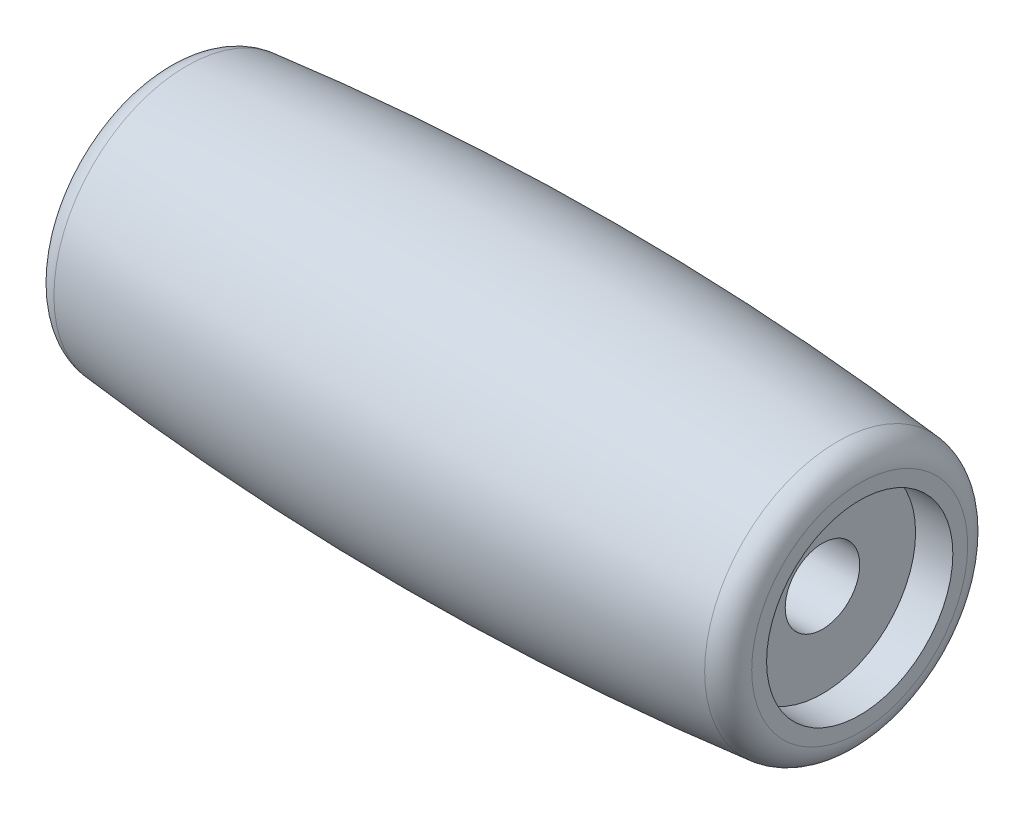
ISO-10303-21;
HEADER;
FILE_DESCRIPTION(('STEP AP214'),'2;1');
FILE_NAME('part.step','',(''),(''),'','','');
FILE_SCHEMA(('AUTOMOTIVE_DESIGN { 1 0 10303 214 1 1 1 1 }'));
ENDSEC;
DATA;
#1=APPLICATION_CONTEXT('core data for automotive mechanical design processes');
#2=APPLICATION_PROTOCOL_DEFINITION('international standard','automotive_design',2000,#1);
#3=PRODUCT_CONTEXT('',#1,'mechanical');
#4=PRODUCT('Part','Part','',(#3));
#5=PRODUCT_RELATED_PRODUCT_CATEGORY('part','',(#4));
#6=PRODUCT_DEFINITION_FORMATION('','',#4);
#7=PRODUCT_DEFINITION_CONTEXT('part definition',#1,'design');
#8=PRODUCT_DEFINITION('design','',#6,#7);
#9=PRODUCT_DEFINITION_SHAPE('','',#8);
#10=(LENGTH_UNIT() NAMED_UNIT(*) SI_UNIT(.MILLI.,.METRE.));
#11=(NAMED_UNIT(*) PLANE_ANGLE_UNIT() SI_UNIT($,.RADIAN.));
#12=(NAMED_UNIT(*) SI_UNIT($,.STERADIAN.) SOLID_ANGLE_UNIT());
#13=UNCERTAINTY_MEASURE_WITH_UNIT(LENGTH_MEASURE(1.E-05),#10,'distance_accuracy_value','');
#14=(GEOMETRIC_REPRESENTATION_CONTEXT(3) GLOBAL_UNCERTAINTY_ASSIGNED_CONTEXT((#13)) GLOBAL_UNIT_ASSIGNED_CONTEXT((#10,
#11,#12)) REPRESENTATION_CONTEXT('',''));
#15=CARTESIAN_POINT('',(0.,0.,0.));
#16=DIRECTION('',(0.,0.,1.));
#17=DIRECTION('',(1.,0.,0.));
#18=AXIS2_PLACEMENT_3D('',#15,#16,#17);
#19=CARTESIAN_POINT('',(12.5,1.5,0.));
#20=DIRECTION('',(-1.,0.,0.));
#21=DIRECTION('',(0.,0.,1.));
#22=AXIS2_PLACEMENT_3D('',#19,#20,#21);
#23=PLANE('',#22);
#24=CARTESIAN_POINT('',(12.5,0.,0.));
#25=DIRECTION('',(-1.,0.,0.));
#26=DIRECTION('',(0.,0.,1.));
#27=AXIS2_PLACEMENT_3D('',#24,#25,#26);
#28=CIRCLE('',#27,3.75);
#29=CARTESIAN_POINT('',(12.5,0.,3.75));
#30=VERTEX_POINT('',#29);
#31=EDGE_CURVE('E10',#30,#30,#28,.T.);
#32=ORIENTED_EDGE('',*,*,#31,.F.);
#33=EDGE_LOOP('',(#32));
#34=FACE_BOUND('',#33,.T.);
#35=CARTESIAN_POINT('',(12.5,0.,0.));
#36=DIRECTION('',(-1.,0.,0.));
#37=DIRECTION('',(0.,0.,1.));
#38=AXIS2_PLACEMENT_3D('',#35,#36,#37);
#39=CIRCLE('',#38,1.5);
#40=CARTESIAN_POINT('',(12.5,0.,1.5));
#41=VERTEX_POINT('',#40);
#42=EDGE_CURVE('E84',#41,#41,#39,.T.);
#43=ORIENTED_EDGE('',*,*,#42,.T.);
#44=EDGE_LOOP('',(#43));
#45=FACE_BOUND('',#44,.T.);
#46=ADVANCED_FACE('F41',(#34,#45),#23,.F.);
#47=CARTESIAN_POINT('',(0.,0.,0.));
#48=DIRECTION('',(-1.,0.,0.));
#49=DIRECTION('',(0.,0.,1.));
#50=AXIS2_PLACEMENT_3D('',#47,#48,#49);
#51=CYLINDRICAL_SURFACE('',#50,3.75);
#52=CARTESIAN_POINT('',(14.,0.,0.));
#53=DIRECTION('',(-1.,0.,0.));
#54=DIRECTION('',(0.,0.,1.));
#55=AXIS2_PLACEMENT_3D('',#52,#53,#54);
#56=CIRCLE('',#55,3.75);
#57=CARTESIAN_POINT('',(14.,0.,3.75));
#58=VERTEX_POINT('',#57);
#59=EDGE_CURVE('E48',#58,#58,#56,.T.);
#60=ORIENTED_EDGE('',*,*,#59,.F.);
#61=EDGE_LOOP('',(#60));
#62=FACE_BOUND('',#61,.T.);
#63=ORIENTED_EDGE('',*,*,#31,.T.);
#64=EDGE_LOOP('',(#63));
#65=FACE_BOUND('',#64,.T.);
#66=ADVANCED_FACE('F134',(#62,#65),#51,.F.);
#67=CARTESIAN_POINT('',(14.,3.75,0.));
#68=DIRECTION('',(-1.,0.,0.));
#69=DIRECTION('',(0.,0.,1.));
#70=AXIS2_PLACEMENT_3D('',#67,#68,#69);
#71=PLANE('',#70);
#72=CARTESIAN_POINT('',(14.,0.,0.));
#73=DIRECTION('',(-1.,0.,0.));
#74=DIRECTION('',(0.,0.,1.));
#75=AXIS2_PLACEMENT_3D('',#72,#73,#74);
#76=CIRCLE('',#75,4.34857666506388);
#77=CARTESIAN_POINT('',(14.,0.,4.34857666506388));
#78=VERTEX_POINT('',#77);
#79=EDGE_CURVE('E53',#78,#78,#76,.T.);
#80=ORIENTED_EDGE('',*,*,#79,.F.);
#81=EDGE_LOOP('',(#80));
#82=FACE_BOUND('',#81,.T.);
#83=ORIENTED_EDGE('',*,*,#59,.T.);
#84=EDGE_LOOP('',(#83));
#85=FACE_BOUND('',#84,.T.);
#86=ADVANCED_FACE('F129',(#82,#85),#71,.F.);
#87=CARTESIAN_POINT('',(13.,0.,0.));
#88=DIRECTION('',(-1.,0.,0.));
#89=DIRECTION('',(0.,0.,1.));
#90=AXIS2_PLACEMENT_3D('',#87,#88,#89);
#91=TOROIDAL_SURFACE('',#90,4.34857666506388,1.00000000000001);
#92=CARTESIAN_POINT('',(13.0999679589875,0.,0.));
#93=DIRECTION('',(-1.,0.,0.));
#94=DIRECTION('',(0.,0.,1.));
#95=AXIS2_PLACEMENT_3D('',#92,#93,#94);
#96=CIRCLE('',#95,5.34356732189234);
#97=CARTESIAN_POINT('',(13.0999679589875,0.,5.34356732189234));
#98=VERTEX_POINT('',#97);
#99=EDGE_CURVE('E58',#98,#98,#96,.T.);
#100=ORIENTED_EDGE('',*,*,#99,.F.);
#101=EDGE_LOOP('',(#100));
#102=FACE_BOUND('',#101,.T.);
#103=ORIENTED_EDGE('',*,*,#79,.T.);
#104=EDGE_LOOP('',(#103));
#105=FACE_BOUND('',#104,.T.);
#106=ADVANCED_FACE('F123',(#102,#105),#91,.T.);
#107=CARTESIAN_POINT('',(0.,0.,0.));
#108=DIRECTION('',(-1.,0.,0.));
#109=DIRECTION('',(0.,0.,1.));
#110=AXIS2_PLACEMENT_3D('',#107,#108,#109);
#111=DEGENERATE_TOROIDAL_SURFACE('',#110,125.041666666667,131.041666666667,.F.);
#112=CARTESIAN_POINT('',(-13.0999679589875,0.,0.));
#113=DIRECTION('',(-1.,0.,0.));
#114=DIRECTION('',(0.,0.,1.));
#115=AXIS2_PLACEMENT_3D('',#112,#113,#114);
#116=CIRCLE('',#115,5.34356732189233);
#117=CARTESIAN_POINT('',(-13.0999679589875,0.,5.34356732189233));
#118=VERTEX_POINT('',#117);
#119=EDGE_CURVE('E64',#118,#118,#116,.T.);
#120=ORIENTED_EDGE('',*,*,#119,.F.);
#121=EDGE_LOOP('',(#120));
#122=FACE_BOUND('',#121,.T.);
#123=ORIENTED_EDGE('',*,*,#99,.T.);
#124=EDGE_LOOP('',(#123));
#125=FACE_BOUND('',#124,.T.);
#126=ADVANCED_FACE('F117',(#122,#125),#111,.F.);
#127=CARTESIAN_POINT('',(-13.,0.,0.));
#128=DIRECTION('',(-1.,0.,0.));
#129=DIRECTION('',(0.,0.,1.));
#130=AXIS2_PLACEMENT_3D('',#127,#128,#129);
#131=TOROIDAL_SURFACE('',#130,4.34857666506388,1.00000000000001);
#132=CARTESIAN_POINT('',(-14.,0.,0.));
#133=DIRECTION('',(-1.,0.,0.));
#134=DIRECTION('',(0.,0.,1.));
#135=AXIS2_PLACEMENT_3D('',#132,#133,#134);
#136=CIRCLE('',#135,4.34857666506388);
#137=CARTESIAN_POINT('',(-14.,0.,4.34857666506388));
#138=VERTEX_POINT('',#137);
#139=EDGE_CURVE('E68',#138,#138,#136,.T.);
#140=ORIENTED_EDGE('',*,*,#139,.F.);
#141=EDGE_LOOP('',(#140));
#142=FACE_BOUND('',#141,.T.);
#143=ORIENTED_EDGE('',*,*,#119,.T.);
#144=EDGE_LOOP('',(#143));
#145=FACE_BOUND('',#144,.T.);
#146=ADVANCED_FACE('F111',(#142,#145),#131,.T.);
#147=CARTESIAN_POINT('',(-14.,3.75,0.));
#148=DIRECTION('',(1.,0.,0.));
#149=DIRECTION('',(0.,0.,-1.));
#150=AXIS2_PLACEMENT_3D('',#147,#148,#149);
#151=PLANE('',#150);
#152=CARTESIAN_POINT('',(-14.,0.,0.));
#153=DIRECTION('',(-1.,0.,0.));
#154=DIRECTION('',(0.,0.,1.));
#155=AXIS2_PLACEMENT_3D('',#152,#153,#154);
#156=CIRCLE('',#155,3.75);
#157=CARTESIAN_POINT('',(-14.,0.,3.75));
#158=VERTEX_POINT('',#157);
#159=EDGE_CURVE('E72',#158,#158,#156,.T.);
#160=ORIENTED_EDGE('',*,*,#159,.F.);
#161=EDGE_LOOP('',(#160));
#162=FACE_BOUND('',#161,.T.);
#163=ORIENTED_EDGE('',*,*,#139,.T.);
#164=EDGE_LOOP('',(#163));
#165=FACE_BOUND('',#164,.T.);
#166=ADVANCED_FACE('F105',(#162,#165),#151,.F.);
#167=CARTESIAN_POINT('',(0.,0.,0.));
#168=DIRECTION('',(-1.,0.,0.));
#169=DIRECTION('',(0.,0.,1.));
#170=AXIS2_PLACEMENT_3D('',#167,#168,#169);
#171=CYLINDRICAL_SURFACE('',#170,3.75);
#172=CARTESIAN_POINT('',(-12.5,0.,0.));
#173=DIRECTION('',(-1.,0.,0.));
#174=DIRECTION('',(0.,0.,1.));
#175=AXIS2_PLACEMENT_3D('',#172,#173,#174);
#176=CIRCLE('',#175,3.75);
#177=CARTESIAN_POINT('',(-12.5,0.,3.75));
#178=VERTEX_POINT('',#177);
#179=EDGE_CURVE('E76',#178,#178,#176,.T.);
#180=ORIENTED_EDGE('',*,*,#179,.F.);
#181=EDGE_LOOP('',(#180));
#182=FACE_BOUND('',#181,.T.);
#183=ORIENTED_EDGE('',*,*,#159,.T.);
#184=EDGE_LOOP('',(#183));
#185=FACE_BOUND('',#184,.T.);
#186=ADVANCED_FACE('F99',(#182,#185),#171,.F.);
#187=CARTESIAN_POINT('',(-12.5,1.5,0.));
#188=DIRECTION('',(1.,0.,0.));
#189=DIRECTION('',(0.,0.,-1.));
#190=AXIS2_PLACEMENT_3D('',#187,#188,#189);
#191=PLANE('',#190);
#192=CARTESIAN_POINT('',(-12.5,0.,0.));
#193=DIRECTION('',(-1.,0.,0.));
#194=DIRECTION('',(0.,0.,1.));
#195=AXIS2_PLACEMENT_3D('',#192,#193,#194);
#196=CIRCLE('',#195,1.5);
#197=CARTESIAN_POINT('',(-12.5,0.,1.5));
#198=VERTEX_POINT('',#197);
#199=EDGE_CURVE('E80',#198,#198,#196,.T.);
#200=ORIENTED_EDGE('',*,*,#199,.F.);
#201=EDGE_LOOP('',(#200));
#202=FACE_BOUND('',#201,.T.);
#203=ORIENTED_EDGE('',*,*,#179,.T.);
#204=EDGE_LOOP('',(#203));
#205=FACE_BOUND('',#204,.T.);
#206=ADVANCED_FACE('F93',(#202,#205),#191,.F.);
#207=CARTESIAN_POINT('',(0.,0.,0.));
#208=DIRECTION('',(-1.,0.,0.));
#209=DIRECTION('',(0.,0.,1.));
#210=AXIS2_PLACEMENT_3D('',#207,#208,#209);
#211=CYLINDRICAL_SURFACE('',#210,1.5);
#212=ORIENTED_EDGE('',*,*,#42,.F.);
#213=EDGE_LOOP('',(#212));
#214=FACE_BOUND('',#213,.T.);
#215=ORIENTED_EDGE('',*,*,#199,.T.);
#216=EDGE_LOOP('',(#215));
#217=FACE_BOUND('',#216,.T.);
#218=ADVANCED_FACE('F90',(#214,#217),#211,.F.);
#219=CLOSED_SHELL('',(#46,#66,#86,#106,#126,#146,#166,#186,#206,#218));
#220=MANIFOLD_SOLID_BREP('B2',#219);
#221=ADVANCED_BREP_SHAPE_REPRESENTATION('',(#18,#220),#14);
#222=SHAPE_DEFINITION_REPRESENTATION(#9,#221);
ENDSEC;
END-ISO-10303-21;
